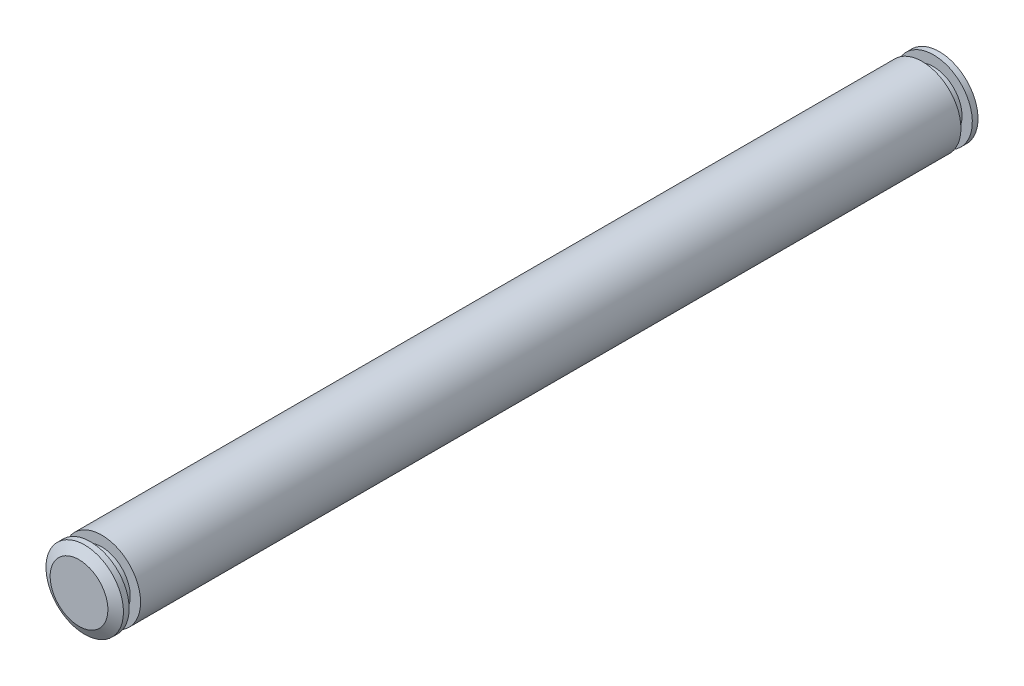
ISO-10303-21;
HEADER;
FILE_DESCRIPTION(('STEP AP214'),'2;1');
FILE_NAME('part.step','',(''),(''),'','','');
FILE_SCHEMA(('AUTOMOTIVE_DESIGN { 1 0 10303 214 1 1 1 1 }'));
ENDSEC;
DATA;
#1=APPLICATION_CONTEXT('core data for automotive mechanical design processes');
#2=APPLICATION_PROTOCOL_DEFINITION('international standard','automotive_design',2000,#1);
#3=PRODUCT_CONTEXT('',#1,'mechanical');
#4=PRODUCT('Part','Part','',(#3));
#5=PRODUCT_RELATED_PRODUCT_CATEGORY('part','',(#4));
#6=PRODUCT_DEFINITION_FORMATION('','',#4);
#7=PRODUCT_DEFINITION_CONTEXT('part definition',#1,'design');
#8=PRODUCT_DEFINITION('design','',#6,#7);
#9=PRODUCT_DEFINITION_SHAPE('','',#8);
#10=(LENGTH_UNIT() NAMED_UNIT(*) SI_UNIT(.MILLI.,.METRE.));
#11=(NAMED_UNIT(*) PLANE_ANGLE_UNIT() SI_UNIT($,.RADIAN.));
#12=(NAMED_UNIT(*) SI_UNIT($,.STERADIAN.) SOLID_ANGLE_UNIT());
#13=UNCERTAINTY_MEASURE_WITH_UNIT(LENGTH_MEASURE(1.E-05),#10,'distance_accuracy_value','');
#14=(GEOMETRIC_REPRESENTATION_CONTEXT(3) GLOBAL_UNCERTAINTY_ASSIGNED_CONTEXT((#13)) GLOBAL_UNIT_ASSIGNED_CONTEXT((#10,
#11,#12)) REPRESENTATION_CONTEXT('',''));
#15=CARTESIAN_POINT('',(0.,0.,0.));
#16=DIRECTION('',(0.,0.,1.));
#17=DIRECTION('',(1.,0.,0.));
#18=AXIS2_PLACEMENT_3D('',#15,#16,#17);
#19=CARTESIAN_POINT('',(0.,0.,38.));
#20=DIRECTION('',(0.,0.,1.));
#21=DIRECTION('',(0.,-1.,0.));
#22=AXIS2_PLACEMENT_3D('',#19,#20,#21);
#23=CYLINDRICAL_SURFACE('',#22,3.40000000000003);
#24=CARTESIAN_POINT('',(0.,0.,-36.));
#25=DIRECTION('',(0.,0.,-1.));
#26=DIRECTION('',(-1.,0.,0.));
#27=AXIS2_PLACEMENT_3D('',#24,#25,#26);
#28=CIRCLE('',#27,3.40000000000003);
#29=CARTESIAN_POINT('',(-3.40000000000003,0.,-36.));
#30=VERTEX_POINT('',#29);
#31=EDGE_CURVE('E63',#30,#30,#28,.T.);
#32=ORIENTED_EDGE('',*,*,#31,.F.);
#33=EDGE_LOOP('',(#32));
#34=FACE_BOUND('',#33,.T.);
#35=CARTESIAN_POINT('',(0.,0.,36.));
#36=DIRECTION('',(0.,0.,1.));
#37=DIRECTION('',(1.,0.,0.));
#38=AXIS2_PLACEMENT_3D('',#35,#36,#37);
#39=CIRCLE('',#38,3.40000000000003);
#40=CARTESIAN_POINT('',(3.40000000000003,0.,36.));
#41=VERTEX_POINT('',#40);
#42=EDGE_CURVE('E45',#41,#41,#39,.T.);
#43=ORIENTED_EDGE('',*,*,#42,.F.);
#44=EDGE_LOOP('',(#43));
#45=FACE_BOUND('',#44,.T.);
#46=ADVANCED_FACE('F41',(#34,#45),#23,.T.);
#47=CARTESIAN_POINT('',(-0.671408174689415,0.,-36.));
#48=DIRECTION('',(0.,0.,-1.));
#49=DIRECTION('',(-1.,0.,0.));
#50=AXIS2_PLACEMENT_3D('',#47,#48,#49);
#51=PLANE('',#50);
#52=CARTESIAN_POINT('',(0.,0.,-36.));
#53=DIRECTION('',(0.,0.,-1.));
#54=DIRECTION('',(-1.,0.,0.));
#55=AXIS2_PLACEMENT_3D('',#52,#53,#54);
#56=CIRCLE('',#55,2.5);
#57=CARTESIAN_POINT('',(-2.5,0.,-36.));
#58=VERTEX_POINT('',#57);
#59=EDGE_CURVE('E64',#58,#58,#56,.T.);
#60=ORIENTED_EDGE('',*,*,#59,.F.);
#61=EDGE_LOOP('',(#60));
#62=FACE_BOUND('',#61,.T.);
#63=ORIENTED_EDGE('',*,*,#31,.T.);
#64=EDGE_LOOP('',(#63));
#65=FACE_BOUND('',#64,.T.);
#66=ADVANCED_FACE('F114',(#62,#65),#51,.T.);
#67=CARTESIAN_POINT('',(-0.671408174689415,0.,-37.));
#68=DIRECTION('',(0.,0.,-1.));
#69=DIRECTION('',(-1.,0.,0.));
#70=AXIS2_PLACEMENT_3D('',#67,#68,#69);
#71=PLANE('',#70);
#72=CARTESIAN_POINT('',(0.,0.,-37.));
#73=DIRECTION('',(0.,0.,-1.));
#74=DIRECTION('',(-1.,0.,0.));
#75=AXIS2_PLACEMENT_3D('',#72,#73,#74);
#76=CIRCLE('',#75,2.5);
#77=CARTESIAN_POINT('',(-2.5,0.,-37.));
#78=VERTEX_POINT('',#77);
#79=EDGE_CURVE('E74',#78,#78,#76,.T.);
#80=ORIENTED_EDGE('',*,*,#79,.T.);
#81=EDGE_LOOP('',(#80));
#82=FACE_BOUND('',#81,.T.);
#83=CARTESIAN_POINT('',(0.,0.,-37.));
#84=DIRECTION('',(0.,0.,-1.));
#85=DIRECTION('',(-1.,0.,0.));
#86=AXIS2_PLACEMENT_3D('',#83,#84,#85);
#87=CIRCLE('',#86,3.40000000000003);
#88=CARTESIAN_POINT('',(-3.40000000000003,0.,-37.));
#89=VERTEX_POINT('',#88);
#90=EDGE_CURVE('E59',#89,#89,#87,.T.);
#91=ORIENTED_EDGE('',*,*,#90,.F.);
#92=EDGE_LOOP('',(#91));
#93=FACE_BOUND('',#92,.T.);
#94=ADVANCED_FACE('F119',(#82,#93),#71,.F.);
#95=CARTESIAN_POINT('',(0.,0.,-36.));
#96=DIRECTION('',(0.,0.,-1.));
#97=DIRECTION('',(-1.,0.,0.));
#98=AXIS2_PLACEMENT_3D('',#95,#96,#97);
#99=CYLINDRICAL_SURFACE('',#98,2.5);
#100=ORIENTED_EDGE('',*,*,#59,.T.);
#101=EDGE_LOOP('',(#100));
#102=FACE_BOUND('',#101,.T.);
#103=ORIENTED_EDGE('',*,*,#79,.F.);
#104=EDGE_LOOP('',(#103));
#105=FACE_BOUND('',#104,.T.);
#106=ADVANCED_FACE('F108',(#102,#105),#99,.T.);
#107=CARTESIAN_POINT('',(0.,3.40000000000002,-38.));
#108=DIRECTION('',(0.,0.,1.));
#109=DIRECTION('',(0.,-1.,0.));
#110=AXIS2_PLACEMENT_3D('',#107,#108,#109);
#111=PLANE('',#110);
#112=CARTESIAN_POINT('',(0.,0.,-38.));
#113=DIRECTION('',(0.,0.,1.));
#114=DIRECTION('',(0.,-1.,0.));
#115=AXIS2_PLACEMENT_3D('',#112,#113,#114);
#116=CIRCLE('',#115,2.53397459621563);
#117=CARTESIAN_POINT('',(0.,-2.53397459621566,-38.));
#118=VERTEX_POINT('',#117);
#119=EDGE_CURVE('E49',#118,#118,#116,.F.);
#120=ORIENTED_EDGE('',*,*,#119,.T.);
#121=EDGE_LOOP('',(#120));
#122=FACE_BOUND('',#121,.T.);
#123=ADVANCED_FACE('F98',(#122),#111,.F.);
#124=CARTESIAN_POINT('',(0.,0.,-37.5));
#125=DIRECTION('',(0.,0.,1.));
#126=DIRECTION('',(0.,-1.,0.));
#127=AXIS2_PLACEMENT_3D('',#124,#125,#126);
#128=CONICAL_SURFACE('',#127,3.40000000000003,1.04719755119659);
#129=ORIENTED_EDGE('',*,*,#119,.F.);
#130=EDGE_LOOP('',(#129));
#131=FACE_BOUND('',#130,.T.);
#132=CARTESIAN_POINT('',(0.,0.,-37.5));
#133=DIRECTION('',(0.,0.,1.));
#134=DIRECTION('',(0.,-1.,0.));
#135=AXIS2_PLACEMENT_3D('',#132,#133,#134);
#136=CIRCLE('',#135,3.40000000000003);
#137=CARTESIAN_POINT('',(0.,-3.40000000000006,-37.5));
#138=VERTEX_POINT('',#137);
#139=EDGE_CURVE('E55',#138,#138,#136,.T.);
#140=ORIENTED_EDGE('',*,*,#139,.F.);
#141=EDGE_LOOP('',(#140));
#142=FACE_BOUND('',#141,.T.);
#143=ADVANCED_FACE('F96',(#131,#142),#128,.T.);
#144=ORIENTED_EDGE('',*,*,#90,.T.);
#145=EDGE_LOOP('',(#144));
#146=FACE_BOUND('',#145,.T.);
#147=ORIENTED_EDGE('',*,*,#139,.T.);
#148=EDGE_LOOP('',(#147));
#149=FACE_BOUND('',#148,.T.);
#150=ADVANCED_FACE('F94',(#146,#149),#23,.T.);
#151=CARTESIAN_POINT('',(-0.671408174689415,0.,36.));
#152=DIRECTION('',(0.,0.,1.));
#153=DIRECTION('',(1.,0.,0.));
#154=AXIS2_PLACEMENT_3D('',#151,#152,#153);
#155=PLANE('',#154);
#156=CARTESIAN_POINT('',(0.,0.,36.));
#157=DIRECTION('',(0.,0.,-1.));
#158=DIRECTION('',(-1.,0.,0.));
#159=AXIS2_PLACEMENT_3D('',#156,#157,#158);
#160=CIRCLE('',#159,2.5);
#161=CARTESIAN_POINT('',(-2.5,0.,36.));
#162=VERTEX_POINT('',#161);
#163=EDGE_CURVE('E70',#162,#162,#160,.T.);
#164=ORIENTED_EDGE('',*,*,#163,.T.);
#165=EDGE_LOOP('',(#164));
#166=FACE_BOUND('',#165,.T.);
#167=ORIENTED_EDGE('',*,*,#42,.T.);
#168=EDGE_LOOP('',(#167));
#169=FACE_BOUND('',#168,.T.);
#170=ADVANCED_FACE('F104',(#166,#169),#155,.T.);
#171=CARTESIAN_POINT('',(-0.671408174689415,0.,37.));
#172=DIRECTION('',(0.,0.,1.));
#173=DIRECTION('',(1.,0.,0.));
#174=AXIS2_PLACEMENT_3D('',#171,#172,#173);
#175=PLANE('',#174);
#176=CARTESIAN_POINT('',(0.,0.,37.));
#177=DIRECTION('',(0.,0.,-1.));
#178=DIRECTION('',(-1.,0.,0.));
#179=AXIS2_PLACEMENT_3D('',#176,#177,#178);
#180=CIRCLE('',#179,2.5);
#181=CARTESIAN_POINT('',(-2.5,0.,37.));
#182=VERTEX_POINT('',#181);
#183=EDGE_CURVE('E76',#182,#182,#180,.T.);
#184=ORIENTED_EDGE('',*,*,#183,.F.);
#185=EDGE_LOOP('',(#184));
#186=FACE_BOUND('',#185,.T.);
#187=CARTESIAN_POINT('',(0.,0.,37.));
#188=DIRECTION('',(0.,0.,1.));
#189=DIRECTION('',(1.,0.,0.));
#190=AXIS2_PLACEMENT_3D('',#187,#188,#189);
#191=CIRCLE('',#190,3.40000000000003);
#192=CARTESIAN_POINT('',(3.40000000000003,0.,37.));
#193=VERTEX_POINT('',#192);
#194=EDGE_CURVE('E68',#193,#193,#191,.T.);
#195=ORIENTED_EDGE('',*,*,#194,.F.);
#196=EDGE_LOOP('',(#195));
#197=FACE_BOUND('',#196,.T.);
#198=ADVANCED_FACE('F140',(#186,#197),#175,.F.);
#199=CARTESIAN_POINT('',(0.,0.,36.));
#200=DIRECTION('',(0.,0.,1.));
#201=DIRECTION('',(1.,0.,0.));
#202=AXIS2_PLACEMENT_3D('',#199,#200,#201);
#203=CYLINDRICAL_SURFACE('',#202,2.5);
#204=ORIENTED_EDGE('',*,*,#163,.F.);
#205=EDGE_LOOP('',(#204));
#206=FACE_BOUND('',#205,.T.);
#207=ORIENTED_EDGE('',*,*,#183,.T.);
#208=EDGE_LOOP('',(#207));
#209=FACE_BOUND('',#208,.T.);
#210=ADVANCED_FACE('F136',(#206,#209),#203,.T.);
#211=CARTESIAN_POINT('',(0.,0.,38.));
#212=DIRECTION('',(0.,0.,-1.));
#213=DIRECTION('',(0.,1.,0.));
#214=AXIS2_PLACEMENT_3D('',#211,#212,#213);
#215=PLANE('',#214);
#216=CARTESIAN_POINT('',(0.,0.,38.));
#217=DIRECTION('',(0.,0.,-1.));
#218=DIRECTION('',(0.,1.,0.));
#219=AXIS2_PLACEMENT_3D('',#216,#217,#218);
#220=CIRCLE('',#219,2.53397459621556);
#221=CARTESIAN_POINT('',(0.,2.53397459621556,38.));
#222=VERTEX_POINT('',#221);
#223=EDGE_CURVE('E11',#222,#222,#220,.F.);
#224=ORIENTED_EDGE('',*,*,#223,.T.);
#225=EDGE_LOOP('',(#224));
#226=FACE_BOUND('',#225,.T.);
#227=ADVANCED_FACE('F128',(#226),#215,.F.);
#228=CARTESIAN_POINT('',(0.,0.,38.));
#229=DIRECTION('',(0.,0.,-1.));
#230=DIRECTION('',(0.,1.,0.));
#231=AXIS2_PLACEMENT_3D('',#228,#229,#230);
#232=CONICAL_SURFACE('',#231,2.53397459621556,1.0471975511966);
#233=CARTESIAN_POINT('',(0.,0.,37.5));
#234=DIRECTION('',(0.,0.,-1.));
#235=DIRECTION('',(0.,1.,0.));
#236=AXIS2_PLACEMENT_3D('',#233,#234,#235);
#237=CIRCLE('',#236,3.40000000000003);
#238=CARTESIAN_POINT('',(0.,3.40000000000003,37.5));
#239=VERTEX_POINT('',#238);
#240=EDGE_CURVE('E67',#239,#239,#237,.T.);
#241=ORIENTED_EDGE('',*,*,#240,.F.);
#242=EDGE_LOOP('',(#241));
#243=FACE_BOUND('',#242,.T.);
#244=ORIENTED_EDGE('',*,*,#223,.F.);
#245=EDGE_LOOP('',(#244));
#246=FACE_BOUND('',#245,.T.);
#247=ADVANCED_FACE('F43',(#243,#246),#232,.T.);
#248=ORIENTED_EDGE('',*,*,#194,.T.);
#249=EDGE_LOOP('',(#248));
#250=FACE_BOUND('',#249,.T.);
#251=ORIENTED_EDGE('',*,*,#240,.T.);
#252=EDGE_LOOP('',(#251));
#253=FACE_BOUND('',#252,.T.);
#254=ADVANCED_FACE('F107',(#250,#253),#23,.T.);
#255=CLOSED_SHELL('',(#46,#66,#94,#106,#123,#143,#150,#170,#198,#210,#227,#247,#254));
#256=MANIFOLD_SOLID_BREP('B2',#255);
#257=ADVANCED_BREP_SHAPE_REPRESENTATION('',(#18,#256),#14);
#258=SHAPE_DEFINITION_REPRESENTATION(#9,#257);
ENDSEC;
END-ISO-10303-21;
